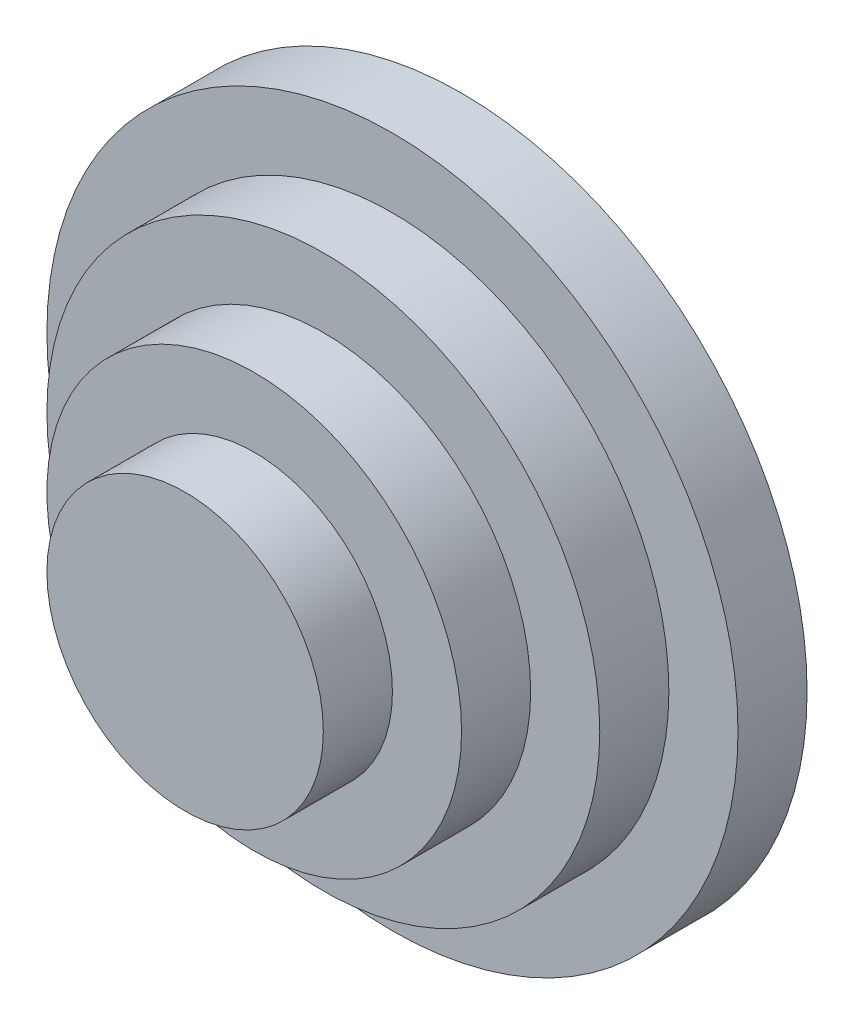
ISO-10303-21;
HEADER;
FILE_DESCRIPTION(('STEP AP214'),'2;1');
FILE_NAME('part.step','',(''),(''),'','','');
FILE_SCHEMA(('AUTOMOTIVE_DESIGN { 1 0 10303 214 1 1 1 1 }'));
ENDSEC;
DATA;
#1=APPLICATION_CONTEXT('core data for automotive mechanical design processes');
#2=APPLICATION_PROTOCOL_DEFINITION('international standard','automotive_design',2000,#1);
#3=PRODUCT_CONTEXT('',#1,'mechanical');
#4=PRODUCT('Part','Part','',(#3));
#5=PRODUCT_RELATED_PRODUCT_CATEGORY('part','',(#4));
#6=PRODUCT_DEFINITION_FORMATION('','',#4);
#7=PRODUCT_DEFINITION_CONTEXT('part definition',#1,'design');
#8=PRODUCT_DEFINITION('design','',#6,#7);
#9=PRODUCT_DEFINITION_SHAPE('','',#8);
#10=(LENGTH_UNIT() NAMED_UNIT(*) SI_UNIT(.MILLI.,.METRE.));
#11=(NAMED_UNIT(*) PLANE_ANGLE_UNIT() SI_UNIT($,.RADIAN.));
#12=(NAMED_UNIT(*) SI_UNIT($,.STERADIAN.) SOLID_ANGLE_UNIT());
#13=UNCERTAINTY_MEASURE_WITH_UNIT(LENGTH_MEASURE(1.E-05),#10,'distance_accuracy_value','');
#14=(GEOMETRIC_REPRESENTATION_CONTEXT(3) GLOBAL_UNCERTAINTY_ASSIGNED_CONTEXT((#13)) GLOBAL_UNIT_ASSIGNED_CONTEXT((#10,
#11,#12)) REPRESENTATION_CONTEXT('',''));
#15=CARTESIAN_POINT('',(0.,0.,0.));
#16=DIRECTION('',(0.,0.,1.));
#17=DIRECTION('',(1.,0.,0.));
#18=AXIS2_PLACEMENT_3D('',#15,#16,#17);
#19=CARTESIAN_POINT('',(0.,0.,5.));
#20=DIRECTION('',(0.,0.,-1.));
#21=DIRECTION('',(-1.,0.,0.));
#22=AXIS2_PLACEMENT_3D('',#19,#20,#21);
#23=CYLINDRICAL_SURFACE('',#22,25.);
#24=CARTESIAN_POINT('',(0.,0.,5.));
#25=DIRECTION('',(0.,0.,1.));
#26=DIRECTION('',(1.,0.,0.));
#27=AXIS2_PLACEMENT_3D('',#24,#25,#26);
#28=CIRCLE('',#27,25.);
#29=CARTESIAN_POINT('',(25.,0.,5.));
#30=VERTEX_POINT('',#29);
#31=EDGE_CURVE('E10',#30,#30,#28,.T.);
#32=ORIENTED_EDGE('',*,*,#31,.F.);
#33=EDGE_LOOP('',(#32));
#34=FACE_BOUND('',#33,.T.);
#35=CARTESIAN_POINT('',(0.,0.,0.));
#36=DIRECTION('',(0.,0.,1.));
#37=DIRECTION('',(1.,0.,0.));
#38=AXIS2_PLACEMENT_3D('',#35,#36,#37);
#39=CIRCLE('',#38,25.);
#40=CARTESIAN_POINT('',(25.,0.,0.));
#41=VERTEX_POINT('',#40);
#42=EDGE_CURVE('E35',#41,#41,#39,.T.);
#43=ORIENTED_EDGE('',*,*,#42,.T.);
#44=EDGE_LOOP('',(#43));
#45=FACE_BOUND('',#44,.T.);
#46=ADVANCED_FACE('F32',(#34,#45),#23,.T.);
#47=CARTESIAN_POINT('',(0.,0.,5.));
#48=DIRECTION('',(0.,0.,1.));
#49=DIRECTION('',(1.,0.,0.));
#50=AXIS2_PLACEMENT_3D('',#47,#48,#49);
#51=PLANE('',#50);
#52=CARTESIAN_POINT('',(0.,0.,5.));
#53=DIRECTION('',(0.,0.,1.));
#54=DIRECTION('',(1.,0.,0.));
#55=AXIS2_PLACEMENT_3D('',#52,#53,#54);
#56=CIRCLE('',#55,20.);
#57=CARTESIAN_POINT('',(20.,0.,5.));
#58=VERTEX_POINT('',#57);
#59=EDGE_CURVE('E44',#58,#58,#56,.T.);
#60=ORIENTED_EDGE('',*,*,#59,.F.);
#61=EDGE_LOOP('',(#60));
#62=FACE_BOUND('',#61,.T.);
#63=ORIENTED_EDGE('',*,*,#31,.T.);
#64=EDGE_LOOP('',(#63));
#65=FACE_BOUND('',#64,.T.);
#66=ADVANCED_FACE('F95',(#62,#65),#51,.T.);
#67=CARTESIAN_POINT('',(0.,0.,0.));
#68=DIRECTION('',(0.,0.,1.));
#69=DIRECTION('',(1.,0.,0.));
#70=AXIS2_PLACEMENT_3D('',#67,#68,#69);
#71=PLANE('',#70);
#72=ORIENTED_EDGE('',*,*,#42,.F.);
#73=EDGE_LOOP('',(#72));
#74=FACE_BOUND('',#73,.T.);
#75=ADVANCED_FACE('F91',(#74),#71,.F.);
#76=CARTESIAN_POINT('',(0.,0.,10.));
#77=DIRECTION('',(0.,0.,-1.));
#78=DIRECTION('',(-1.,0.,0.));
#79=AXIS2_PLACEMENT_3D('',#76,#77,#78);
#80=CYLINDRICAL_SURFACE('',#79,20.);
#81=CARTESIAN_POINT('',(0.,0.,10.));
#82=DIRECTION('',(0.,0.,1.));
#83=DIRECTION('',(1.,0.,0.));
#84=AXIS2_PLACEMENT_3D('',#81,#82,#83);
#85=CIRCLE('',#84,20.);
#86=CARTESIAN_POINT('',(20.,0.,10.));
#87=VERTEX_POINT('',#86);
#88=EDGE_CURVE('E42',#87,#87,#85,.T.);
#89=ORIENTED_EDGE('',*,*,#88,.F.);
#90=EDGE_LOOP('',(#89));
#91=FACE_BOUND('',#90,.T.);
#92=ORIENTED_EDGE('',*,*,#59,.T.);
#93=EDGE_LOOP('',(#92));
#94=FACE_BOUND('',#93,.T.);
#95=ADVANCED_FACE('F85',(#91,#94),#80,.T.);
#96=CARTESIAN_POINT('',(0.,0.,10.));
#97=DIRECTION('',(0.,0.,1.));
#98=DIRECTION('',(1.,0.,0.));
#99=AXIS2_PLACEMENT_3D('',#96,#97,#98);
#100=PLANE('',#99);
#101=CARTESIAN_POINT('',(0.,0.,10.));
#102=DIRECTION('',(0.,0.,1.));
#103=DIRECTION('',(1.,0.,0.));
#104=AXIS2_PLACEMENT_3D('',#101,#102,#103);
#105=CIRCLE('',#104,15.);
#106=CARTESIAN_POINT('',(15.,0.,10.));
#107=VERTEX_POINT('',#106);
#108=EDGE_CURVE('E50',#107,#107,#105,.T.);
#109=ORIENTED_EDGE('',*,*,#108,.F.);
#110=EDGE_LOOP('',(#109));
#111=FACE_BOUND('',#110,.T.);
#112=ORIENTED_EDGE('',*,*,#88,.T.);
#113=EDGE_LOOP('',(#112));
#114=FACE_BOUND('',#113,.T.);
#115=ADVANCED_FACE('F79',(#111,#114),#100,.T.);
#116=CARTESIAN_POINT('',(0.,0.,15.));
#117=DIRECTION('',(0.,0.,-1.));
#118=DIRECTION('',(-1.,0.,0.));
#119=AXIS2_PLACEMENT_3D('',#116,#117,#118);
#120=CYLINDRICAL_SURFACE('',#119,15.);
#121=CARTESIAN_POINT('',(0.,0.,15.));
#122=DIRECTION('',(0.,0.,1.));
#123=DIRECTION('',(1.,0.,0.));
#124=AXIS2_PLACEMENT_3D('',#121,#122,#123);
#125=CIRCLE('',#124,15.);
#126=CARTESIAN_POINT('',(15.,0.,15.));
#127=VERTEX_POINT('',#126);
#128=EDGE_CURVE('E47',#127,#127,#125,.T.);
#129=ORIENTED_EDGE('',*,*,#128,.F.);
#130=EDGE_LOOP('',(#129));
#131=FACE_BOUND('',#130,.T.);
#132=ORIENTED_EDGE('',*,*,#108,.T.);
#133=EDGE_LOOP('',(#132));
#134=FACE_BOUND('',#133,.T.);
#135=ADVANCED_FACE('F73',(#131,#134),#120,.T.);
#136=CARTESIAN_POINT('',(0.,0.,15.));
#137=DIRECTION('',(0.,0.,1.));
#138=DIRECTION('',(1.,0.,0.));
#139=AXIS2_PLACEMENT_3D('',#136,#137,#138);
#140=PLANE('',#139);
#141=CARTESIAN_POINT('',(0.,0.,15.));
#142=DIRECTION('',(0.,0.,1.));
#143=DIRECTION('',(1.,0.,0.));
#144=AXIS2_PLACEMENT_3D('',#141,#142,#143);
#145=CIRCLE('',#144,10.);
#146=CARTESIAN_POINT('',(10.,0.,15.));
#147=VERTEX_POINT('',#146);
#148=EDGE_CURVE('E56',#147,#147,#145,.T.);
#149=ORIENTED_EDGE('',*,*,#148,.F.);
#150=EDGE_LOOP('',(#149));
#151=FACE_BOUND('',#150,.T.);
#152=ORIENTED_EDGE('',*,*,#128,.T.);
#153=EDGE_LOOP('',(#152));
#154=FACE_BOUND('',#153,.T.);
#155=ADVANCED_FACE('F67',(#151,#154),#140,.T.);
#156=CARTESIAN_POINT('',(0.,0.,20.));
#157=DIRECTION('',(0.,0.,-1.));
#158=DIRECTION('',(-1.,0.,0.));
#159=AXIS2_PLACEMENT_3D('',#156,#157,#158);
#160=CYLINDRICAL_SURFACE('',#159,10.);
#161=CARTESIAN_POINT('',(0.,0.,20.));
#162=DIRECTION('',(0.,0.,1.));
#163=DIRECTION('',(1.,0.,0.));
#164=AXIS2_PLACEMENT_3D('',#161,#162,#163);
#165=CIRCLE('',#164,10.);
#166=CARTESIAN_POINT('',(10.,0.,20.));
#167=VERTEX_POINT('',#166);
#168=EDGE_CURVE('E53',#167,#167,#165,.T.);
#169=ORIENTED_EDGE('',*,*,#168,.F.);
#170=EDGE_LOOP('',(#169));
#171=FACE_BOUND('',#170,.T.);
#172=ORIENTED_EDGE('',*,*,#148,.T.);
#173=EDGE_LOOP('',(#172));
#174=FACE_BOUND('',#173,.T.);
#175=ADVANCED_FACE('F64',(#171,#174),#160,.T.);
#176=CARTESIAN_POINT('',(0.,0.,20.));
#177=DIRECTION('',(0.,0.,1.));
#178=DIRECTION('',(1.,0.,0.));
#179=AXIS2_PLACEMENT_3D('',#176,#177,#178);
#180=PLANE('',#179);
#181=ORIENTED_EDGE('',*,*,#168,.T.);
#182=EDGE_LOOP('',(#181));
#183=FACE_BOUND('',#182,.T.);
#184=ADVANCED_FACE('F62',(#183),#180,.T.);
#185=CLOSED_SHELL('',(#46,#66,#75,#95,#115,#135,#155,#175,#184));
#186=MANIFOLD_SOLID_BREP('B2',#185);
#187=ADVANCED_BREP_SHAPE_REPRESENTATION('',(#18,#186),#14);
#188=SHAPE_DEFINITION_REPRESENTATION(#9,#187);
ENDSEC;
END-ISO-10303-21;
